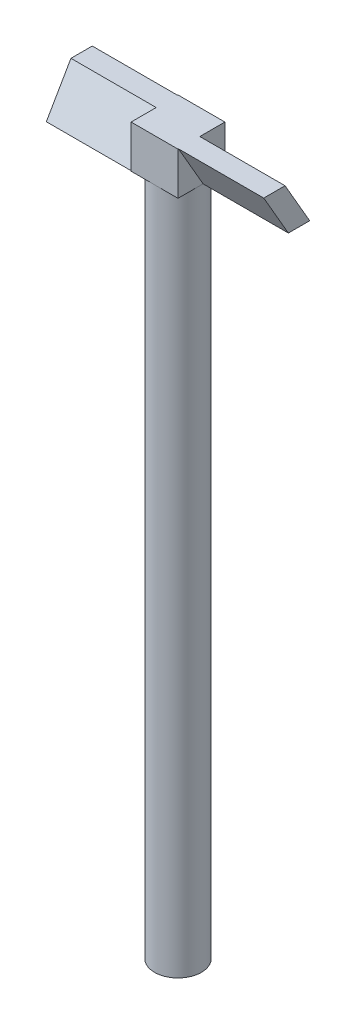
ISO-10303-21;
HEADER;
FILE_DESCRIPTION(('STEP AP214'),'2;1');
FILE_NAME('part.step','',(''),(''),'','','');
FILE_SCHEMA(('AUTOMOTIVE_DESIGN { 1 0 10303 214 1 1 1 1 }'));
ENDSEC;
DATA;
#1=APPLICATION_CONTEXT('core data for automotive mechanical design processes');
#2=APPLICATION_PROTOCOL_DEFINITION('international standard','automotive_design',2000,#1);
#3=PRODUCT_CONTEXT('',#1,'mechanical');
#4=PRODUCT('Part','Part','',(#3));
#5=PRODUCT_RELATED_PRODUCT_CATEGORY('part','',(#4));
#6=PRODUCT_DEFINITION_FORMATION('','',#4);
#7=PRODUCT_DEFINITION_CONTEXT('part definition',#1,'design');
#8=PRODUCT_DEFINITION('design','',#6,#7);
#9=PRODUCT_DEFINITION_SHAPE('','',#8);
#10=(LENGTH_UNIT() NAMED_UNIT(*) SI_UNIT(.MILLI.,.METRE.));
#11=(NAMED_UNIT(*) PLANE_ANGLE_UNIT() SI_UNIT($,.RADIAN.));
#12=(NAMED_UNIT(*) SI_UNIT($,.STERADIAN.) SOLID_ANGLE_UNIT());
#13=UNCERTAINTY_MEASURE_WITH_UNIT(LENGTH_MEASURE(1.E-05),#10,'distance_accuracy_value','');
#14=(GEOMETRIC_REPRESENTATION_CONTEXT(3) GLOBAL_UNCERTAINTY_ASSIGNED_CONTEXT((#13)) GLOBAL_UNIT_ASSIGNED_CONTEXT((#10,
#11,#12)) REPRESENTATION_CONTEXT('',''));
#15=CARTESIAN_POINT('',(0.,0.,0.));
#16=DIRECTION('',(0.,0.,1.));
#17=DIRECTION('',(1.,0.,0.));
#18=AXIS2_PLACEMENT_3D('',#15,#16,#17);
#19=CARTESIAN_POINT('',(5.5,170.,-5.5));
#20=DIRECTION('',(-1.,0.,0.));
#21=DIRECTION('',(0.,0.,1.));
#22=AXIS2_PLACEMENT_3D('',#19,#20,#21);
#23=PLANE('',#22);
#24=DIRECTION('',(0.,-0.86602540378444,-0.499999999999998));
#25=VECTOR('',#24,1.);
#26=CARTESIAN_POINT('',(5.5,170.,5.38675134594812));
#27=LINE('',#26,#25);
#28=CARTESIAN_POINT('',(5.5,170.,5.38675134594812));
#29=VERTEX_POINT('',#28);
#30=CARTESIAN_POINT('',(5.5,160.,-0.386751345948116));
#31=VERTEX_POINT('',#30);
#32=EDGE_CURVE('E171',#29,#31,#27,.T.);
#33=ORIENTED_EDGE('',*,*,#32,.F.);
#34=DIRECTION('',(0.,0.,-1.));
#35=VECTOR('',#34,1.);
#36=CARTESIAN_POINT('',(5.5,170.,-5.5));
#37=LINE('',#36,#35);
#38=CARTESIAN_POINT('',(5.5,170.,5.5));
#39=VERTEX_POINT('',#38);
#40=EDGE_CURVE('E199',#39,#29,#37,.T.);
#41=ORIENTED_EDGE('',*,*,#40,.F.);
#42=DIRECTION('',(0.,-1.,0.));
#43=VECTOR('',#42,1.);
#44=CARTESIAN_POINT('',(5.5,170.,5.5));
#45=LINE('',#44,#43);
#46=CARTESIAN_POINT('',(5.5,160.,5.5));
#47=VERTEX_POINT('',#46);
#48=EDGE_CURVE('E211',#39,#47,#45,.T.);
#49=ORIENTED_EDGE('',*,*,#48,.T.);
#50=DIRECTION('',(0.,0.,-1.));
#51=VECTOR('',#50,1.);
#52=CARTESIAN_POINT('',(5.5,160.,-5.5));
#53=LINE('',#52,#51);
#54=CARTESIAN_POINT('',(5.5,160.,0.));
#55=VERTEX_POINT('',#54);
#56=EDGE_CURVE('E212',#47,#55,#53,.T.);
#57=ORIENTED_EDGE('',*,*,#56,.T.);
#58=EDGE_CURVE('E216',#55,#31,#53,.T.);
#59=ORIENTED_EDGE('',*,*,#58,.T.);
#60=EDGE_LOOP('',(#33,#41,#49,#57,#59));
#61=FACE_BOUND('',#60,.T.);
#62=ADVANCED_FACE('F45',(#61),#23,.F.);
#63=DIRECTION('',(0.,0.86602540378444,0.499999999999998));
#64=VECTOR('',#63,1.);
#65=CARTESIAN_POINT('',(5.5,170.,0.386751345948117));
#66=LINE('',#65,#64);
#67=CARTESIAN_POINT('',(5.5,160.,-5.38675134594812));
#68=VERTEX_POINT('',#67);
#69=CARTESIAN_POINT('',(5.5,170.,0.386751345948117));
#70=VERTEX_POINT('',#69);
#71=EDGE_CURVE('E167',#68,#70,#66,.T.);
#72=ORIENTED_EDGE('',*,*,#71,.F.);
#73=CARTESIAN_POINT('',(5.5,160.,-5.5));
#74=VERTEX_POINT('',#73);
#75=EDGE_CURVE('E198',#68,#74,#53,.T.);
#76=ORIENTED_EDGE('',*,*,#75,.T.);
#77=DIRECTION('',(0.,-1.,0.));
#78=VECTOR('',#77,1.);
#79=CARTESIAN_POINT('',(5.5,170.,-5.5));
#80=LINE('',#79,#78);
#81=CARTESIAN_POINT('',(5.5,170.,-5.5));
#82=VERTEX_POINT('',#81);
#83=EDGE_CURVE('E237',#82,#74,#80,.T.);
#84=ORIENTED_EDGE('',*,*,#83,.F.);
#85=EDGE_CURVE('E203',#70,#82,#37,.T.);
#86=ORIENTED_EDGE('',*,*,#85,.F.);
#87=EDGE_LOOP('',(#72,#76,#84,#86));
#88=FACE_BOUND('',#87,.T.);
#89=ADVANCED_FACE('F278',(#88),#23,.F.);
#90=CARTESIAN_POINT('',(-5.5,170.,-5.5));
#91=DIRECTION('',(1.,0.,0.));
#92=DIRECTION('',(0.,0.,-1.));
#93=AXIS2_PLACEMENT_3D('',#90,#91,#92);
#94=PLANE('',#93);
#95=DIRECTION('',(0.,-0.86602540378444,0.499999999999998));
#96=VECTOR('',#95,1.);
#97=CARTESIAN_POINT('',(-5.5,170.,-5.38675134594812));
#98=LINE('',#97,#96);
#99=CARTESIAN_POINT('',(-5.5,170.,-5.38675134594812));
#100=VERTEX_POINT('',#99);
#101=CARTESIAN_POINT('',(-5.5,160.,0.386751345948116));
#102=VERTEX_POINT('',#101);
#103=EDGE_CURVE('E173',#100,#102,#98,.T.);
#104=ORIENTED_EDGE('',*,*,#103,.F.);
#105=DIRECTION('',(0.,0.,1.));
#106=VECTOR('',#105,1.);
#107=CARTESIAN_POINT('',(-5.5,170.,-5.5));
#108=LINE('',#107,#106);
#109=CARTESIAN_POINT('',(-5.5,170.,-5.5));
#110=VERTEX_POINT('',#109);
#111=EDGE_CURVE('E206',#110,#100,#108,.T.);
#112=ORIENTED_EDGE('',*,*,#111,.F.);
#113=DIRECTION('',(0.,-1.,0.));
#114=VECTOR('',#113,1.);
#115=CARTESIAN_POINT('',(-5.5,170.,-5.5));
#116=LINE('',#115,#114);
#117=CARTESIAN_POINT('',(-5.5,160.,-5.5));
#118=VERTEX_POINT('',#117);
#119=EDGE_CURVE('E234',#110,#118,#116,.T.);
#120=ORIENTED_EDGE('',*,*,#119,.T.);
#121=DIRECTION('',(0.,0.,1.));
#122=VECTOR('',#121,1.);
#123=CARTESIAN_POINT('',(-5.5,160.,-5.5));
#124=LINE('',#123,#122);
#125=CARTESIAN_POINT('',(-5.5,160.,0.));
#126=VERTEX_POINT('',#125);
#127=EDGE_CURVE('E221',#118,#126,#124,.T.);
#128=ORIENTED_EDGE('',*,*,#127,.T.);
#129=EDGE_CURVE('E225',#126,#102,#124,.T.);
#130=ORIENTED_EDGE('',*,*,#129,.T.);
#131=EDGE_LOOP('',(#104,#112,#120,#128,#130));
#132=FACE_BOUND('',#131,.T.);
#133=ADVANCED_FACE('F284',(#132),#94,.F.);
#134=DIRECTION('',(0.,0.86602540378444,-0.499999999999998));
#135=VECTOR('',#134,1.);
#136=CARTESIAN_POINT('',(-5.5,170.,-0.386751345948117));
#137=LINE('',#136,#135);
#138=CARTESIAN_POINT('',(-5.5,160.,5.38675134594812));
#139=VERTEX_POINT('',#138);
#140=CARTESIAN_POINT('',(-5.5,170.,-0.386751345948117));
#141=VERTEX_POINT('',#140);
#142=EDGE_CURVE('E176',#139,#141,#137,.T.);
#143=ORIENTED_EDGE('',*,*,#142,.F.);
#144=CARTESIAN_POINT('',(-5.5,160.,5.5));
#145=VERTEX_POINT('',#144);
#146=EDGE_CURVE('E220',#139,#145,#124,.T.);
#147=ORIENTED_EDGE('',*,*,#146,.T.);
#148=DIRECTION('',(0.,-1.,0.));
#149=VECTOR('',#148,1.);
#150=CARTESIAN_POINT('',(-5.5,170.,5.5));
#151=LINE('',#150,#149);
#152=CARTESIAN_POINT('',(-5.5,170.,5.5));
#153=VERTEX_POINT('',#152);
#154=EDGE_CURVE('E231',#153,#145,#151,.T.);
#155=ORIENTED_EDGE('',*,*,#154,.F.);
#156=EDGE_CURVE('E205',#141,#153,#108,.T.);
#157=ORIENTED_EDGE('',*,*,#156,.F.);
#158=EDGE_LOOP('',(#143,#147,#155,#157));
#159=FACE_BOUND('',#158,.T.);
#160=ADVANCED_FACE('F296',(#159),#94,.F.);
#161=CARTESIAN_POINT('',(0.,160.,0.));
#162=DIRECTION('',(0.,-1.,0.));
#163=DIRECTION('',(0.,0.,-1.));
#164=AXIS2_PLACEMENT_3D('',#161,#162,#163);
#165=CYLINDRICAL_SURFACE('',#164,5.5);
#166=CARTESIAN_POINT('',(0.,160.,0.));
#167=DIRECTION('',(0.,1.,0.));
#168=DIRECTION('',(0.,0.,1.));
#169=AXIS2_PLACEMENT_3D('',#166,#167,#168);
#170=CIRCLE('',#169,5.5);
#171=CARTESIAN_POINT('',(0.,160.,5.5));
#172=VERTEX_POINT('',#171);
#173=EDGE_CURVE('E11',#172,#55,#170,.T.);
#174=ORIENTED_EDGE('',*,*,#173,.F.);
#175=EDGE_CURVE('E55',#126,#172,#170,.T.);
#176=ORIENTED_EDGE('',*,*,#175,.F.);
#177=CARTESIAN_POINT('',(0.,160.,-5.5));
#178=VERTEX_POINT('',#177);
#179=EDGE_CURVE('E246',#178,#126,#170,.T.);
#180=ORIENTED_EDGE('',*,*,#179,.F.);
#181=EDGE_CURVE('E54',#55,#178,#170,.T.);
#182=ORIENTED_EDGE('',*,*,#181,.F.);
#183=EDGE_LOOP('',(#174,#176,#180,#182));
#184=FACE_BOUND('',#183,.T.);
#185=CARTESIAN_POINT('',(0.,0.,0.));
#186=DIRECTION('',(0.,1.,0.));
#187=DIRECTION('',(0.,0.,1.));
#188=AXIS2_PLACEMENT_3D('',#185,#186,#187);
#189=CIRCLE('',#188,5.5);
#190=CARTESIAN_POINT('',(0.,0.,5.5));
#191=VERTEX_POINT('',#190);
#192=EDGE_CURVE('E49',#191,#191,#189,.T.);
#193=ORIENTED_EDGE('',*,*,#192,.T.);
#194=EDGE_LOOP('',(#193));
#195=FACE_BOUND('',#194,.T.);
#196=ADVANCED_FACE('F47',(#184,#195),#165,.T.);
#197=CARTESIAN_POINT('',(0.,0.,0.));
#198=DIRECTION('',(0.,1.,0.));
#199=DIRECTION('',(0.,0.,1.));
#200=AXIS2_PLACEMENT_3D('',#197,#198,#199);
#201=PLANE('',#200);
#202=CARTESIAN_POINT('',(0.,0.,0.));
#203=DIRECTION('',(0.,-1.,0.));
#204=DIRECTION('',(0.,0.,-1.));
#205=AXIS2_PLACEMENT_3D('',#202,#203,#204);
#206=CIRCLE('',#205,1.625);
#207=CARTESIAN_POINT('',(0.,0.,-1.625));
#208=VERTEX_POINT('',#207);
#209=EDGE_CURVE('E300',#208,#208,#206,.T.);
#210=ORIENTED_EDGE('',*,*,#209,.F.);
#211=EDGE_LOOP('',(#210));
#212=FACE_BOUND('',#211,.T.);
#213=ORIENTED_EDGE('',*,*,#192,.F.);
#214=EDGE_LOOP('',(#213));
#215=FACE_BOUND('',#214,.T.);
#216=ADVANCED_FACE('F286',(#212,#215),#201,.F.);
#217=CARTESIAN_POINT('',(0.,160.,0.));
#218=DIRECTION('',(0.,1.,0.));
#219=DIRECTION('',(0.,0.,1.));
#220=AXIS2_PLACEMENT_3D('',#217,#218,#219);
#221=PLANE('',#220);
#222=DIRECTION('',(1.,0.,0.));
#223=VECTOR('',#222,1.);
#224=CARTESIAN_POINT('',(-5.5,160.,5.5));
#225=LINE('',#224,#223);
#226=EDGE_CURVE('E224',#172,#47,#225,.T.);
#227=ORIENTED_EDGE('',*,*,#226,.F.);
#228=ORIENTED_EDGE('',*,*,#173,.T.);
#229=ORIENTED_EDGE('',*,*,#56,.F.);
#230=EDGE_LOOP('',(#227,#228,#229));
#231=FACE_BOUND('',#230,.T.);
#232=ADVANCED_FACE('F274',(#231),#221,.F.);
#233=ORIENTED_EDGE('',*,*,#58,.F.);
#234=ORIENTED_EDGE('',*,*,#181,.T.);
#235=DIRECTION('',(-1.,0.,0.));
#236=VECTOR('',#235,1.);
#237=CARTESIAN_POINT('',(-5.5,160.,-5.5));
#238=LINE('',#237,#236);
#239=EDGE_CURVE('E217',#74,#178,#238,.T.);
#240=ORIENTED_EDGE('',*,*,#239,.F.);
#241=ORIENTED_EDGE('',*,*,#75,.F.);
#242=DIRECTION('',(-1.,0.,0.));
#243=VECTOR('',#242,1.);
#244=CARTESIAN_POINT('',(25.5,160.,-5.38675134594812));
#245=LINE('',#244,#243);
#246=CARTESIAN_POINT('',(25.5,160.,-5.38675134594812));
#247=VERTEX_POINT('',#246);
#248=EDGE_CURVE('E156',#247,#68,#245,.T.);
#249=ORIENTED_EDGE('',*,*,#248,.F.);
#250=DIRECTION('',(0.,0.,-1.));
#251=VECTOR('',#250,1.);
#252=CARTESIAN_POINT('',(25.5,160.,-5.38675134594812));
#253=LINE('',#252,#251);
#254=CARTESIAN_POINT('',(25.5,160.,-0.386751345948114));
#255=VERTEX_POINT('',#254);
#256=EDGE_CURVE('E148',#255,#247,#253,.T.);
#257=ORIENTED_EDGE('',*,*,#256,.F.);
#258=DIRECTION('',(-1.,0.,0.));
#259=VECTOR('',#258,1.);
#260=CARTESIAN_POINT('',(25.5,160.,-0.386751345948114));
#261=LINE('',#260,#259);
#262=EDGE_CURVE('E153',#255,#31,#261,.T.);
#263=ORIENTED_EDGE('',*,*,#262,.T.);
#264=EDGE_LOOP('',(#233,#234,#240,#241,#249,#257,#263));
#265=FACE_BOUND('',#264,.T.);
#266=ADVANCED_FACE('F151',(#265),#221,.F.);
#267=EDGE_CURVE('E215',#178,#118,#238,.T.);
#268=ORIENTED_EDGE('',*,*,#267,.F.);
#269=ORIENTED_EDGE('',*,*,#179,.T.);
#270=ORIENTED_EDGE('',*,*,#127,.F.);
#271=EDGE_LOOP('',(#268,#269,#270));
#272=FACE_BOUND('',#271,.T.);
#273=ADVANCED_FACE('F258',(#272),#221,.F.);
#274=ORIENTED_EDGE('',*,*,#129,.F.);
#275=ORIENTED_EDGE('',*,*,#175,.T.);
#276=EDGE_CURVE('E226',#145,#172,#225,.T.);
#277=ORIENTED_EDGE('',*,*,#276,.F.);
#278=ORIENTED_EDGE('',*,*,#146,.F.);
#279=DIRECTION('',(1.,0.,0.));
#280=VECTOR('',#279,1.);
#281=CARTESIAN_POINT('',(-25.5,160.,5.38675134594812));
#282=LINE('',#281,#280);
#283=CARTESIAN_POINT('',(-25.5,160.,5.38675134594812));
#284=VERTEX_POINT('',#283);
#285=EDGE_CURVE('E194',#284,#139,#282,.T.);
#286=ORIENTED_EDGE('',*,*,#285,.F.);
#287=DIRECTION('',(0.,0.,1.));
#288=VECTOR('',#287,1.);
#289=CARTESIAN_POINT('',(-25.5,160.,5.38675134594812));
#290=LINE('',#289,#288);
#291=CARTESIAN_POINT('',(-25.5,160.,0.386751345948114));
#292=VERTEX_POINT('',#291);
#293=EDGE_CURVE('E184',#292,#284,#290,.T.);
#294=ORIENTED_EDGE('',*,*,#293,.F.);
#295=DIRECTION('',(1.,0.,0.));
#296=VECTOR('',#295,1.);
#297=CARTESIAN_POINT('',(-25.5,160.,0.386751345948114));
#298=LINE('',#297,#296);
#299=EDGE_CURVE('E196',#292,#102,#298,.T.);
#300=ORIENTED_EDGE('',*,*,#299,.T.);
#301=EDGE_LOOP('',(#274,#275,#277,#278,#286,#294,#300));
#302=FACE_BOUND('',#301,.T.);
#303=ADVANCED_FACE('F263',(#302),#221,.F.);
#304=CARTESIAN_POINT('',(-5.5,170.,-5.5));
#305=DIRECTION('',(0.,0.,1.));
#306=DIRECTION('',(1.,0.,0.));
#307=AXIS2_PLACEMENT_3D('',#304,#305,#306);
#308=PLANE('',#307);
#309=ORIENTED_EDGE('',*,*,#239,.T.);
#310=ORIENTED_EDGE('',*,*,#267,.T.);
#311=ORIENTED_EDGE('',*,*,#119,.F.);
#312=DIRECTION('',(-1.,0.,0.));
#313=VECTOR('',#312,1.);
#314=CARTESIAN_POINT('',(-5.5,170.,-5.5));
#315=LINE('',#314,#313);
#316=EDGE_CURVE('E202',#82,#110,#315,.T.);
#317=ORIENTED_EDGE('',*,*,#316,.F.);
#318=ORIENTED_EDGE('',*,*,#83,.T.);
#319=EDGE_LOOP('',(#309,#310,#311,#317,#318));
#320=FACE_BOUND('',#319,.T.);
#321=ADVANCED_FACE('F260',(#320),#308,.F.);
#322=CARTESIAN_POINT('',(-5.5,170.,5.5));
#323=DIRECTION('',(0.,0.,-1.));
#324=DIRECTION('',(-1.,0.,0.));
#325=AXIS2_PLACEMENT_3D('',#322,#323,#324);
#326=PLANE('',#325);
#327=ORIENTED_EDGE('',*,*,#276,.T.);
#328=ORIENTED_EDGE('',*,*,#226,.T.);
#329=ORIENTED_EDGE('',*,*,#48,.F.);
#330=DIRECTION('',(1.,0.,0.));
#331=VECTOR('',#330,1.);
#332=CARTESIAN_POINT('',(-5.5,170.,5.5));
#333=LINE('',#332,#331);
#334=EDGE_CURVE('E209',#153,#39,#333,.T.);
#335=ORIENTED_EDGE('',*,*,#334,.F.);
#336=ORIENTED_EDGE('',*,*,#154,.T.);
#337=EDGE_LOOP('',(#327,#328,#329,#335,#336));
#338=FACE_BOUND('',#337,.T.);
#339=ADVANCED_FACE('F262',(#338),#326,.F.);
#340=CARTESIAN_POINT('',(0.,170.,0.));
#341=DIRECTION('',(0.,1.,0.));
#342=DIRECTION('',(0.,0.,1.));
#343=AXIS2_PLACEMENT_3D('',#340,#341,#342);
#344=PLANE('',#343);
#345=ORIENTED_EDGE('',*,*,#40,.T.);
#346=DIRECTION('',(-1.,0.,0.));
#347=VECTOR('',#346,1.);
#348=CARTESIAN_POINT('',(25.5,170.,5.38675134594812));
#349=LINE('',#348,#347);
#350=CARTESIAN_POINT('',(25.5,170.,5.38675134594812));
#351=VERTEX_POINT('',#350);
#352=EDGE_CURVE('E309',#351,#29,#349,.T.);
#353=ORIENTED_EDGE('',*,*,#352,.F.);
#354=DIRECTION('',(0.,0.,1.));
#355=VECTOR('',#354,1.);
#356=CARTESIAN_POINT('',(25.5,170.,5.38675134594812));
#357=LINE('',#356,#355);
#358=CARTESIAN_POINT('',(25.5,170.,0.386751345948119));
#359=VERTEX_POINT('',#358);
#360=EDGE_CURVE('E164',#359,#351,#357,.T.);
#361=ORIENTED_EDGE('',*,*,#360,.F.);
#362=DIRECTION('',(-1.,0.,0.));
#363=VECTOR('',#362,1.);
#364=CARTESIAN_POINT('',(25.5,170.,0.386751345948119));
#365=LINE('',#364,#363);
#366=EDGE_CURVE('E62',#359,#70,#365,.T.);
#367=ORIENTED_EDGE('',*,*,#366,.T.);
#368=ORIENTED_EDGE('',*,*,#85,.T.);
#369=ORIENTED_EDGE('',*,*,#316,.T.);
#370=ORIENTED_EDGE('',*,*,#111,.T.);
#371=DIRECTION('',(1.,0.,0.));
#372=VECTOR('',#371,1.);
#373=CARTESIAN_POINT('',(-25.5,170.,-5.38675134594812));
#374=LINE('',#373,#372);
#375=CARTESIAN_POINT('',(-25.5,170.,-5.38675134594812));
#376=VERTEX_POINT('',#375);
#377=EDGE_CURVE('E189',#376,#100,#374,.T.);
#378=ORIENTED_EDGE('',*,*,#377,.F.);
#379=DIRECTION('',(0.,0.,-1.));
#380=VECTOR('',#379,1.);
#381=CARTESIAN_POINT('',(-25.5,170.,-5.38675134594812));
#382=LINE('',#381,#380);
#383=CARTESIAN_POINT('',(-25.5,170.,-0.386751345948119));
#384=VERTEX_POINT('',#383);
#385=EDGE_CURVE('E188',#384,#376,#382,.T.);
#386=ORIENTED_EDGE('',*,*,#385,.F.);
#387=DIRECTION('',(1.,0.,0.));
#388=VECTOR('',#387,1.);
#389=CARTESIAN_POINT('',(-25.5,170.,-0.386751345948119));
#390=LINE('',#389,#388);
#391=EDGE_CURVE('E69',#384,#141,#390,.T.);
#392=ORIENTED_EDGE('',*,*,#391,.T.);
#393=ORIENTED_EDGE('',*,*,#156,.T.);
#394=ORIENTED_EDGE('',*,*,#334,.T.);
#395=EDGE_LOOP('',(#345,#353,#361,#367,#368,#369,#370,#378,#386,#392,#393,#394));
#396=FACE_BOUND('',#395,.T.);
#397=ADVANCED_FACE('F269',(#396),#344,.T.);
#398=CARTESIAN_POINT('',(-25.5,170.,-5.38675134594812));
#399=DIRECTION('',(0.,0.499999999999998,0.86602540378444));
#400=DIRECTION('',(0.,-0.86602540378444,0.499999999999998));
#401=AXIS2_PLACEMENT_3D('',#398,#399,#400);
#402=PLANE('',#401);
#403=ORIENTED_EDGE('',*,*,#103,.T.);
#404=ORIENTED_EDGE('',*,*,#299,.F.);
#405=DIRECTION('',(0.,-0.86602540378444,0.499999999999998));
#406=VECTOR('',#405,1.);
#407=CARTESIAN_POINT('',(-25.5,170.,-5.38675134594812));
#408=LINE('',#407,#406);
#409=EDGE_CURVE('E181',#376,#292,#408,.T.);
#410=ORIENTED_EDGE('',*,*,#409,.F.);
#411=ORIENTED_EDGE('',*,*,#377,.T.);
#412=EDGE_LOOP('',(#403,#404,#410,#411));
#413=FACE_BOUND('',#412,.T.);
#414=ADVANCED_FACE('F330',(#413),#402,.F.);
#415=CARTESIAN_POINT('',(-25.5,170.,-0.386751345948119));
#416=DIRECTION('',(0.,-0.499999999999998,-0.86602540378444));
#417=DIRECTION('',(0.,0.86602540378444,-0.499999999999998));
#418=AXIS2_PLACEMENT_3D('',#415,#416,#417);
#419=PLANE('',#418);
#420=ORIENTED_EDGE('',*,*,#142,.T.);
#421=ORIENTED_EDGE('',*,*,#391,.F.);
#422=DIRECTION('',(0.,0.86602540378444,-0.499999999999998));
#423=VECTOR('',#422,1.);
#424=CARTESIAN_POINT('',(-25.5,170.,-0.386751345948119));
#425=LINE('',#424,#423);
#426=EDGE_CURVE('E186',#284,#384,#425,.T.);
#427=ORIENTED_EDGE('',*,*,#426,.F.);
#428=ORIENTED_EDGE('',*,*,#285,.T.);
#429=EDGE_LOOP('',(#420,#421,#427,#428));
#430=FACE_BOUND('',#429,.T.);
#431=ADVANCED_FACE('F348',(#430),#419,.F.);
#432=CARTESIAN_POINT('',(-25.5,0.,0.));
#433=DIRECTION('',(1.,0.,0.));
#434=DIRECTION('',(0.,0.,-1.));
#435=AXIS2_PLACEMENT_3D('',#432,#433,#434);
#436=PLANE('',#435);
#437=ORIENTED_EDGE('',*,*,#409,.T.);
#438=ORIENTED_EDGE('',*,*,#293,.T.);
#439=ORIENTED_EDGE('',*,*,#426,.T.);
#440=ORIENTED_EDGE('',*,*,#385,.T.);
#441=EDGE_LOOP('',(#437,#438,#439,#440));
#442=FACE_BOUND('',#441,.T.);
#443=ADVANCED_FACE('F343',(#442),#436,.F.);
#444=CARTESIAN_POINT('',(25.5,170.,5.38675134594812));
#445=DIRECTION('',(0.,0.499999999999998,-0.86602540378444));
#446=DIRECTION('',(0.,0.86602540378444,0.499999999999998));
#447=AXIS2_PLACEMENT_3D('',#444,#445,#446);
#448=PLANE('',#447);
#449=ORIENTED_EDGE('',*,*,#32,.T.);
#450=ORIENTED_EDGE('',*,*,#262,.F.);
#451=DIRECTION('',(0.,-0.86602540378444,-0.499999999999998));
#452=VECTOR('',#451,1.);
#453=CARTESIAN_POINT('',(25.5,170.,5.38675134594812));
#454=LINE('',#453,#452);
#455=EDGE_CURVE('E160',#351,#255,#454,.T.);
#456=ORIENTED_EDGE('',*,*,#455,.F.);
#457=ORIENTED_EDGE('',*,*,#352,.T.);
#458=EDGE_LOOP('',(#449,#450,#456,#457));
#459=FACE_BOUND('',#458,.T.);
#460=ADVANCED_FACE('F169',(#459),#448,.F.);
#461=CARTESIAN_POINT('',(25.5,170.,0.386751345948119));
#462=DIRECTION('',(0.,-0.499999999999998,0.86602540378444));
#463=DIRECTION('',(0.,-0.86602540378444,-0.499999999999998));
#464=AXIS2_PLACEMENT_3D('',#461,#462,#463);
#465=PLANE('',#464);
#466=ORIENTED_EDGE('',*,*,#71,.T.);
#467=ORIENTED_EDGE('',*,*,#366,.F.);
#468=DIRECTION('',(0.,0.86602540378444,0.499999999999998));
#469=VECTOR('',#468,1.);
#470=CARTESIAN_POINT('',(25.5,170.,0.386751345948119));
#471=LINE('',#470,#469);
#472=EDGE_CURVE('E159',#247,#359,#471,.T.);
#473=ORIENTED_EDGE('',*,*,#472,.F.);
#474=ORIENTED_EDGE('',*,*,#248,.T.);
#475=EDGE_LOOP('',(#466,#467,#473,#474));
#476=FACE_BOUND('',#475,.T.);
#477=ADVANCED_FACE('F335',(#476),#465,.F.);
#478=CARTESIAN_POINT('',(25.5,0.,0.));
#479=DIRECTION('',(-1.,0.,0.));
#480=DIRECTION('',(0.,0.,1.));
#481=AXIS2_PLACEMENT_3D('',#478,#479,#480);
#482=PLANE('',#481);
#483=ORIENTED_EDGE('',*,*,#455,.T.);
#484=ORIENTED_EDGE('',*,*,#256,.T.);
#485=ORIENTED_EDGE('',*,*,#472,.T.);
#486=ORIENTED_EDGE('',*,*,#360,.T.);
#487=EDGE_LOOP('',(#483,#484,#485,#486));
#488=FACE_BOUND('',#487,.T.);
#489=ADVANCED_FACE('F163',(#488),#482,.F.);
#490=CARTESIAN_POINT('',(0.,45.,0.));
#491=DIRECTION('',(0.,-1.,0.));
#492=DIRECTION('',(0.,0.,-1.));
#493=AXIS2_PLACEMENT_3D('',#490,#491,#492);
#494=CYLINDRICAL_SURFACE('',#493,1.625);
#495=CARTESIAN_POINT('',(0.,45.,0.));
#496=DIRECTION('',(0.,-1.,0.));
#497=DIRECTION('',(0.,0.,-1.));
#498=AXIS2_PLACEMENT_3D('',#495,#496,#497);
#499=CIRCLE('',#498,1.625);
#500=CARTESIAN_POINT('',(0.,45.,-1.625));
#501=VERTEX_POINT('',#500);
#502=EDGE_CURVE('E302',#501,#501,#499,.T.);
#503=CARTESIAN_POINT('',(0.,45.,-1.625));
#504=CARTESIAN_POINT('',(0.,44.53125,-1.625));
#505=CARTESIAN_POINT('',(0.,44.0625,-1.625));
#506=CARTESIAN_POINT('',(0.,43.125,-1.625));
#507=CARTESIAN_POINT('',(0.,42.65625,-1.625));
#508=CARTESIAN_POINT('',(0.,41.71875,-1.625));
#509=CARTESIAN_POINT('',(0.,41.25,-1.625));
#510=CARTESIAN_POINT('',(0.,40.3125,-1.625));
#511=CARTESIAN_POINT('',(0.,39.84375,-1.625));
#512=CARTESIAN_POINT('',(0.,38.90625,-1.625));
#513=CARTESIAN_POINT('',(0.,38.4375,-1.625));
#514=CARTESIAN_POINT('',(0.,37.5,-1.625));
#515=CARTESIAN_POINT('',(0.,37.03125,-1.625));
#516=CARTESIAN_POINT('',(0.,36.09375,-1.625));
#517=CARTESIAN_POINT('',(0.,35.625,-1.625));
#518=CARTESIAN_POINT('',(0.,34.6875,-1.625));
#519=CARTESIAN_POINT('',(0.,34.21875,-1.625));
#520=CARTESIAN_POINT('',(0.,33.28125,-1.625));
#521=CARTESIAN_POINT('',(0.,32.8125,-1.625));
#522=CARTESIAN_POINT('',(0.,31.875,-1.625));
#523=CARTESIAN_POINT('',(0.,31.40625,-1.625));
#524=CARTESIAN_POINT('',(0.,30.46875,-1.625));
#525=CARTESIAN_POINT('',(0.,30.,-1.625));
#526=CARTESIAN_POINT('',(0.,29.0625,-1.625));
#527=CARTESIAN_POINT('',(0.,28.59375,-1.625));
#528=CARTESIAN_POINT('',(0.,27.65625,-1.625));
#529=CARTESIAN_POINT('',(0.,27.1875,-1.625));
#530=CARTESIAN_POINT('',(0.,26.25,-1.625));
#531=CARTESIAN_POINT('',(0.,25.78125,-1.625));
#532=CARTESIAN_POINT('',(0.,24.84375,-1.625));
#533=CARTESIAN_POINT('',(0.,24.375,-1.625));
#534=CARTESIAN_POINT('',(0.,23.4375,-1.625));
#535=CARTESIAN_POINT('',(0.,22.96875,-1.625));
#536=CARTESIAN_POINT('',(0.,22.03125,-1.625));
#537=CARTESIAN_POINT('',(0.,21.5625,-1.625));
#538=CARTESIAN_POINT('',(0.,20.625,-1.625));
#539=CARTESIAN_POINT('',(0.,20.15625,-1.625));
#540=CARTESIAN_POINT('',(0.,19.21875,-1.625));
#541=CARTESIAN_POINT('',(0.,18.75,-1.625));
#542=CARTESIAN_POINT('',(0.,17.8125,-1.625));
#543=CARTESIAN_POINT('',(0.,17.34375,-1.625));
#544=CARTESIAN_POINT('',(0.,16.40625,-1.625));
#545=CARTESIAN_POINT('',(0.,15.9375,-1.625));
#546=CARTESIAN_POINT('',(0.,15.,-1.625));
#547=CARTESIAN_POINT('',(0.,14.53125,-1.625));
#548=CARTESIAN_POINT('',(0.,13.59375,-1.625));
#549=CARTESIAN_POINT('',(0.,13.125,-1.625));
#550=CARTESIAN_POINT('',(0.,12.1875,-1.625));
#551=CARTESIAN_POINT('',(0.,11.71875,-1.625));
#552=CARTESIAN_POINT('',(0.,10.78125,-1.625));
#553=CARTESIAN_POINT('',(0.,10.3125,-1.625));
#554=CARTESIAN_POINT('',(0.,9.37500000000001,-1.625));
#555=CARTESIAN_POINT('',(0.,8.90625000000001,-1.625));
#556=CARTESIAN_POINT('',(0.,7.96875000000001,-1.625));
#557=CARTESIAN_POINT('',(0.,7.50000000000001,-1.625));
#558=CARTESIAN_POINT('',(0.,6.56250000000001,-1.625));
#559=CARTESIAN_POINT('',(0.,6.09375000000001,-1.625));
#560=CARTESIAN_POINT('',(0.,5.15625000000001,-1.625));
#561=CARTESIAN_POINT('',(0.,4.68750000000001,-1.625));
#562=CARTESIAN_POINT('',(0.,3.75000000000001,-1.625));
#563=CARTESIAN_POINT('',(0.,3.28125000000001,-1.625));
#564=CARTESIAN_POINT('',(0.,2.34375000000001,-1.625));
#565=CARTESIAN_POINT('',(0.,1.87500000000001,-1.625));
#566=CARTESIAN_POINT('',(0.,0.937500000000006,-1.625));
#567=CARTESIAN_POINT('',(0.,0.468750000000007,-1.625));
#568=CARTESIAN_POINT('',(0.,0.,-1.625));
#569=B_SPLINE_CURVE_WITH_KNOTS('',3,(#503,#504,#505,#506,#507,#508,#509,#510,#511,#512,#513,
#514,#515,#516,#517,#518,#519,#520,#521,#522,#523,#524,#525,#526,#527,#528,#529,#530,#531,#532,
#533,#534,#535,#536,#537,#538,#539,#540,#541,#542,#543,#544,#545,#546,#547,#548,#549,#550,#551,
#552,#553,#554,#555,#556,#557,#558,#559,#560,#561,#562,#563,#564,#565,#566,#567,#568),
.UNSPECIFIED.,.F.,.F.,(4,2,2,2,2,2,2,2,2,2,2,2,2,2,2,2,2,2,2,2,2,2,2,2,2,2,2,2,2,2,2,2,4),(0.,
1.40625,2.8125,4.21875,5.62500000000001,7.03125,8.4375,9.84375000000001,11.25,12.65625,14.0625,
15.46875,16.875,18.28125,19.6875,21.09375,22.5,23.90625,25.3125,26.71875,28.125,29.53125,
30.9375,32.34375,33.75,35.15625,36.5625,37.96875,39.375,40.78125,42.1875,43.59375,45.),.UNSPECIFIED.);
#570=EDGE_CURVE('BSEAM341',#501,#208,#569,.T.);
#571=ORIENTED_EDGE('',*,*,#502,.F.);
#572=ORIENTED_EDGE('',*,*,#209,.T.);
#573=ORIENTED_EDGE('',*,*,#570,.T.);
#574=ORIENTED_EDGE('',*,*,#570,.F.);
#575=EDGE_LOOP('',(#571,#573,#572,#574));
#576=FACE_BOUND('',#575,.T.);
#577=ADVANCED_FACE('F341',(#576),#494,.F.);
#578=CARTESIAN_POINT('',(0.,45.,0.));
#579=DIRECTION('',(0.,-1.,0.));
#580=DIRECTION('',(0.,0.,-1.));
#581=AXIS2_PLACEMENT_3D('',#578,#579,#580);
#582=PLANE('',#581);
#583=ORIENTED_EDGE('',*,*,#502,.T.);
#584=EDGE_LOOP('',(#583));
#585=FACE_BOUND('',#584,.T.);
#586=ADVANCED_FACE('F436',(#585),#582,.T.);
#587=CLOSED_SHELL('',(#62,#89,#133,#160,#196,#216,#232,#266,#273,#303,#321,#339,#397,#414,#431,
#443,#460,#477,#489,#577,#586));
#588=MANIFOLD_SOLID_BREP('B2',#587);
#589=ADVANCED_BREP_SHAPE_REPRESENTATION('',(#18,#588),#14);
#590=SHAPE_DEFINITION_REPRESENTATION(#9,#589);
ENDSEC;
END-ISO-10303-21;
